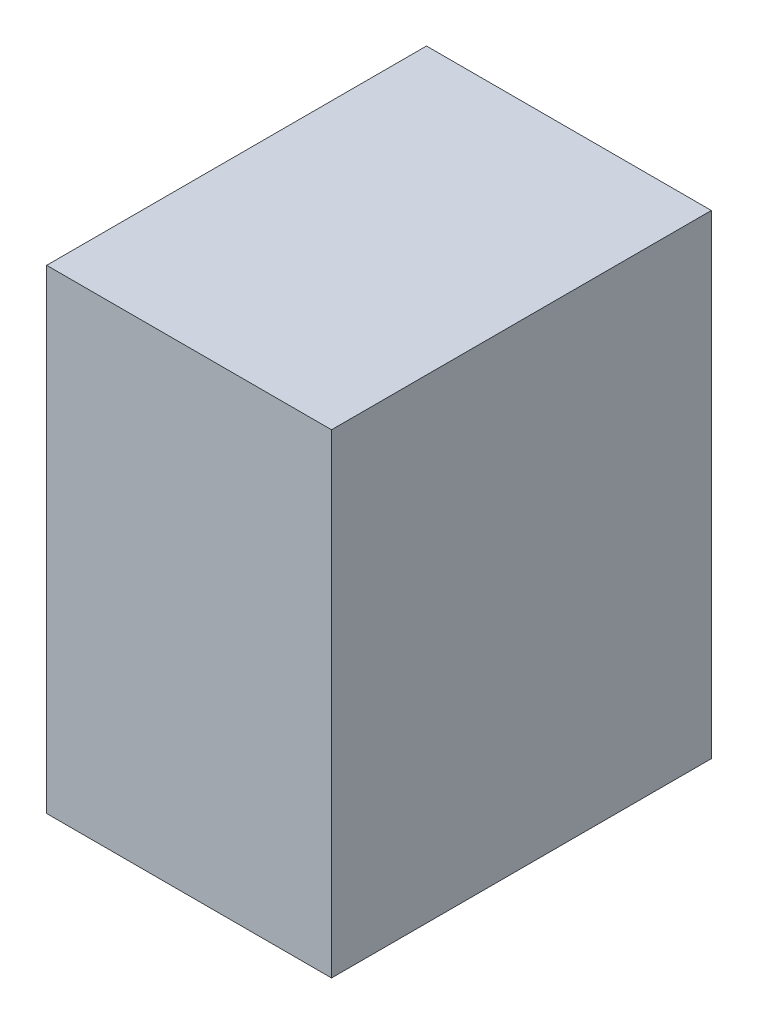
ISO-10303-21;
HEADER;
FILE_DESCRIPTION(('STEP AP214'),'2;1');
FILE_NAME('part.step','',(''),(''),'','','');
FILE_SCHEMA(('AUTOMOTIVE_DESIGN { 1 0 10303 214 1 1 1 1 }'));
ENDSEC;
DATA;
#1=APPLICATION_CONTEXT('core data for automotive mechanical design processes');
#2=APPLICATION_PROTOCOL_DEFINITION('international standard','automotive_design',2000,#1);
#3=PRODUCT_CONTEXT('',#1,'mechanical');
#4=PRODUCT('Part','Part','',(#3));
#5=PRODUCT_RELATED_PRODUCT_CATEGORY('part','',(#4));
#6=PRODUCT_DEFINITION_FORMATION('','',#4);
#7=PRODUCT_DEFINITION_CONTEXT('part definition',#1,'design');
#8=PRODUCT_DEFINITION('design','',#6,#7);
#9=PRODUCT_DEFINITION_SHAPE('','',#8);
#10=(LENGTH_UNIT() NAMED_UNIT(*) SI_UNIT(.MILLI.,.METRE.));
#11=(NAMED_UNIT(*) PLANE_ANGLE_UNIT() SI_UNIT($,.RADIAN.));
#12=(NAMED_UNIT(*) SI_UNIT($,.STERADIAN.) SOLID_ANGLE_UNIT());
#13=UNCERTAINTY_MEASURE_WITH_UNIT(LENGTH_MEASURE(1.E-05),#10,'distance_accuracy_value','');
#14=(GEOMETRIC_REPRESENTATION_CONTEXT(3) GLOBAL_UNCERTAINTY_ASSIGNED_CONTEXT((#13)) GLOBAL_UNIT_ASSIGNED_CONTEXT((#10,
#11,#12)) REPRESENTATION_CONTEXT('',''));
#15=CARTESIAN_POINT('',(0.,0.,0.));
#16=DIRECTION('',(0.,0.,1.));
#17=DIRECTION('',(1.,0.,0.));
#18=AXIS2_PLACEMENT_3D('',#15,#16,#17);
#19=CARTESIAN_POINT('',(0.,0.,0.));
#20=DIRECTION('',(0.,-1.,0.));
#21=DIRECTION('',(0.,0.,-1.));
#22=AXIS2_PLACEMENT_3D('',#19,#20,#21);
#23=PLANE('',#22);
#24=DIRECTION('',(0.,0.,1.));
#25=VECTOR('',#24,1.);
#26=CARTESIAN_POINT('',(-60.6591503626975,0.,10.3260635258258));
#27=LINE('',#26,#25);
#28=CARTESIAN_POINT('',(-60.6591503626975,0.,6.32606352582575));
#29=VERTEX_POINT('',#28);
#30=CARTESIAN_POINT('',(-60.6591503626975,0.,10.3260635258258));
#31=VERTEX_POINT('',#30);
#32=EDGE_CURVE('E147',#29,#31,#27,.T.);
#33=ORIENTED_EDGE('',*,*,#32,.F.);
#34=DIRECTION('',(-1.,0.,0.));
#35=VECTOR('',#34,1.);
#36=CARTESIAN_POINT('',(-60.6591503626975,0.,6.32606352582575));
#37=LINE('',#36,#35);
#38=CARTESIAN_POINT('',(-57.6591503626975,0.,6.32606352582575));
#39=VERTEX_POINT('',#38);
#40=EDGE_CURVE('E83',#39,#29,#37,.T.);
#41=ORIENTED_EDGE('',*,*,#40,.F.);
#42=DIRECTION('',(0.,0.,-1.));
#43=VECTOR('',#42,1.);
#44=CARTESIAN_POINT('',(-57.6591503626975,0.,10.3260635258258));
#45=LINE('',#44,#43);
#46=CARTESIAN_POINT('',(-57.6591503626975,0.,10.3260635258258));
#47=VERTEX_POINT('',#46);
#48=EDGE_CURVE('E162',#47,#39,#45,.T.);
#49=ORIENTED_EDGE('',*,*,#48,.F.);
#50=DIRECTION('',(1.,0.,0.));
#51=VECTOR('',#50,1.);
#52=CARTESIAN_POINT('',(-60.6591503626975,0.,10.3260635258258));
#53=LINE('',#52,#51);
#54=EDGE_CURVE('E160',#31,#47,#53,.T.);
#55=ORIENTED_EDGE('',*,*,#54,.F.);
#56=EDGE_LOOP('',(#33,#41,#49,#55));
#57=FACE_BOUND('',#56,.T.);
#58=DIRECTION('',(1.,0.,0.));
#59=VECTOR('',#58,1.);
#60=CARTESIAN_POINT('',(0.,0.,6.57606352582575));
#61=LINE('',#60,#59);
#62=CARTESIAN_POINT('',(-60.1591503626975,0.,6.57606352582575));
#63=VERTEX_POINT('',#62);
#64=CARTESIAN_POINT('',(-58.1591503626975,0.,6.57606352582575));
#65=VERTEX_POINT('',#64);
#66=EDGE_CURVE('E138',#63,#65,#61,.T.);
#67=ORIENTED_EDGE('',*,*,#66,.F.);
#68=DIRECTION('',(0.,0.,1.));
#69=VECTOR('',#68,1.);
#70=CARTESIAN_POINT('',(-60.1591503626975,0.,0.));
#71=LINE('',#70,#69);
#72=CARTESIAN_POINT('',(-60.1591503626975,0.,10.0760635258258));
#73=VERTEX_POINT('',#72);
#74=EDGE_CURVE('E53',#63,#73,#71,.T.);
#75=ORIENTED_EDGE('',*,*,#74,.T.);
#76=DIRECTION('',(1.,0.,0.));
#77=VECTOR('',#76,1.);
#78=CARTESIAN_POINT('',(0.,0.,10.0760635258258));
#79=LINE('',#78,#77);
#80=CARTESIAN_POINT('',(-58.1591503626975,0.,10.0760635258258));
#81=VERTEX_POINT('',#80);
#82=EDGE_CURVE('E128',#73,#81,#79,.T.);
#83=ORIENTED_EDGE('',*,*,#82,.T.);
#84=DIRECTION('',(0.,0.,1.));
#85=VECTOR('',#84,1.);
#86=CARTESIAN_POINT('',(-58.1591503626975,0.,0.));
#87=LINE('',#86,#85);
#88=EDGE_CURVE('E140',#65,#81,#87,.T.);
#89=ORIENTED_EDGE('',*,*,#88,.F.);
#90=EDGE_LOOP('',(#67,#75,#83,#89));
#91=FACE_BOUND('',#90,.T.);
#92=ADVANCED_FACE('F38',(#57,#91),#23,.T.);
#93=CARTESIAN_POINT('',(-60.6591503626975,5.,10.3260635258258));
#94=DIRECTION('',(1.,0.,0.));
#95=DIRECTION('',(0.,0.,-1.));
#96=AXIS2_PLACEMENT_3D('',#93,#94,#95);
#97=PLANE('',#96);
#98=ORIENTED_EDGE('',*,*,#32,.T.);
#99=DIRECTION('',(0.,-1.,0.));
#100=VECTOR('',#99,1.);
#101=CARTESIAN_POINT('',(-60.6591503626975,5.,10.3260635258258));
#102=LINE('',#101,#100);
#103=CARTESIAN_POINT('',(-60.6591503626975,5.,10.3260635258258));
#104=VERTEX_POINT('',#103);
#105=EDGE_CURVE('E11',#104,#31,#102,.T.);
#106=ORIENTED_EDGE('',*,*,#105,.F.);
#107=DIRECTION('',(0.,0.,1.));
#108=VECTOR('',#107,1.);
#109=CARTESIAN_POINT('',(-60.6591503626975,5.,10.3260635258258));
#110=LINE('',#109,#108);
#111=CARTESIAN_POINT('',(-60.6591503626975,5.,6.32606352582575));
#112=VERTEX_POINT('',#111);
#113=EDGE_CURVE('E151',#112,#104,#110,.T.);
#114=ORIENTED_EDGE('',*,*,#113,.F.);
#115=DIRECTION('',(0.,-1.,0.));
#116=VECTOR('',#115,1.);
#117=CARTESIAN_POINT('',(-60.6591503626975,5.,6.32606352582575));
#118=LINE('',#117,#116);
#119=EDGE_CURVE('E157',#112,#29,#118,.T.);
#120=ORIENTED_EDGE('',*,*,#119,.T.);
#121=EDGE_LOOP('',(#98,#106,#114,#120));
#122=FACE_BOUND('',#121,.T.);
#123=ADVANCED_FACE('F40',(#122),#97,.F.);
#124=CARTESIAN_POINT('',(-60.6591503626975,5.,10.3260635258258));
#125=DIRECTION('',(0.,0.,-1.));
#126=DIRECTION('',(-1.,0.,0.));
#127=AXIS2_PLACEMENT_3D('',#124,#125,#126);
#128=PLANE('',#127);
#129=ORIENTED_EDGE('',*,*,#54,.T.);
#130=DIRECTION('',(0.,-1.,0.));
#131=VECTOR('',#130,1.);
#132=CARTESIAN_POINT('',(-57.6591503626975,5.,10.3260635258258));
#133=LINE('',#132,#131);
#134=CARTESIAN_POINT('',(-57.6591503626975,5.,10.3260635258258));
#135=VERTEX_POINT('',#134);
#136=EDGE_CURVE('E46',#135,#47,#133,.T.);
#137=ORIENTED_EDGE('',*,*,#136,.F.);
#138=DIRECTION('',(1.,0.,0.));
#139=VECTOR('',#138,1.);
#140=CARTESIAN_POINT('',(-60.6591503626975,5.,10.3260635258258));
#141=LINE('',#140,#139);
#142=EDGE_CURVE('E90',#104,#135,#141,.T.);
#143=ORIENTED_EDGE('',*,*,#142,.F.);
#144=ORIENTED_EDGE('',*,*,#105,.T.);
#145=EDGE_LOOP('',(#129,#137,#143,#144));
#146=FACE_BOUND('',#145,.T.);
#147=ADVANCED_FACE('F188',(#146),#128,.F.);
#148=CARTESIAN_POINT('',(-57.6591503626975,5.,10.3260635258258));
#149=DIRECTION('',(-1.,0.,0.));
#150=DIRECTION('',(0.,0.,1.));
#151=AXIS2_PLACEMENT_3D('',#148,#149,#150);
#152=PLANE('',#151);
#153=ORIENTED_EDGE('',*,*,#48,.T.);
#154=DIRECTION('',(0.,-1.,0.));
#155=VECTOR('',#154,1.);
#156=CARTESIAN_POINT('',(-57.6591503626975,5.,6.32606352582575));
#157=LINE('',#156,#155);
#158=CARTESIAN_POINT('',(-57.6591503626975,5.,6.32606352582575));
#159=VERTEX_POINT('',#158);
#160=EDGE_CURVE('E166',#159,#39,#157,.T.);
#161=ORIENTED_EDGE('',*,*,#160,.F.);
#162=DIRECTION('',(0.,0.,-1.));
#163=VECTOR('',#162,1.);
#164=CARTESIAN_POINT('',(-57.6591503626975,5.,10.3260635258258));
#165=LINE('',#164,#163);
#166=EDGE_CURVE('E154',#135,#159,#165,.T.);
#167=ORIENTED_EDGE('',*,*,#166,.F.);
#168=ORIENTED_EDGE('',*,*,#136,.T.);
#169=EDGE_LOOP('',(#153,#161,#167,#168));
#170=FACE_BOUND('',#169,.T.);
#171=ADVANCED_FACE('F171',(#170),#152,.F.);
#172=CARTESIAN_POINT('',(-60.6591503626975,5.,6.32606352582575));
#173=DIRECTION('',(0.,0.,1.));
#174=DIRECTION('',(1.,0.,0.));
#175=AXIS2_PLACEMENT_3D('',#172,#173,#174);
#176=PLANE('',#175);
#177=ORIENTED_EDGE('',*,*,#40,.T.);
#178=ORIENTED_EDGE('',*,*,#119,.F.);
#179=DIRECTION('',(-1.,0.,0.));
#180=VECTOR('',#179,1.);
#181=CARTESIAN_POINT('',(-60.6591503626975,5.,6.32606352582575));
#182=LINE('',#181,#180);
#183=EDGE_CURVE('E62',#159,#112,#182,.T.);
#184=ORIENTED_EDGE('',*,*,#183,.F.);
#185=ORIENTED_EDGE('',*,*,#160,.T.);
#186=EDGE_LOOP('',(#177,#178,#184,#185));
#187=FACE_BOUND('',#186,.T.);
#188=ADVANCED_FACE('F179',(#187),#176,.F.);
#189=CARTESIAN_POINT('',(0.,5.,0.));
#190=DIRECTION('',(0.,-1.,0.));
#191=DIRECTION('',(0.,0.,-1.));
#192=AXIS2_PLACEMENT_3D('',#189,#190,#191);
#193=PLANE('',#192);
#194=ORIENTED_EDGE('',*,*,#113,.T.);
#195=ORIENTED_EDGE('',*,*,#142,.T.);
#196=ORIENTED_EDGE('',*,*,#166,.T.);
#197=ORIENTED_EDGE('',*,*,#183,.T.);
#198=EDGE_LOOP('',(#194,#195,#196,#197));
#199=FACE_BOUND('',#198,.T.);
#200=ADVANCED_FACE('F181',(#199),#193,.F.);
#201=CARTESIAN_POINT('',(-60.1591503626975,4.,0.));
#202=DIRECTION('',(1.,0.,0.));
#203=DIRECTION('',(0.,0.,-1.));
#204=AXIS2_PLACEMENT_3D('',#201,#202,#203);
#205=PLANE('',#204);
#206=ORIENTED_EDGE('',*,*,#74,.F.);
#207=DIRECTION('',(0.,-1.,0.));
#208=VECTOR('',#207,1.);
#209=CARTESIAN_POINT('',(-60.1591503626975,4.,6.57606352582575));
#210=LINE('',#209,#208);
#211=CARTESIAN_POINT('',(-60.1591503626975,4.,6.57606352582575));
#212=VERTEX_POINT('',#211);
#213=EDGE_CURVE('E111',#212,#63,#210,.T.);
#214=ORIENTED_EDGE('',*,*,#213,.F.);
#215=DIRECTION('',(0.,0.,1.));
#216=VECTOR('',#215,1.);
#217=CARTESIAN_POINT('',(-60.1591503626975,4.,0.));
#218=LINE('',#217,#216);
#219=CARTESIAN_POINT('',(-60.1591503626975,4.,10.0760635258258));
#220=VERTEX_POINT('',#219);
#221=EDGE_CURVE('E114',#212,#220,#218,.T.);
#222=ORIENTED_EDGE('',*,*,#221,.T.);
#223=DIRECTION('',(0.,-1.,0.));
#224=VECTOR('',#223,1.);
#225=CARTESIAN_POINT('',(-60.1591503626975,4.,10.0760635258258));
#226=LINE('',#225,#224);
#227=EDGE_CURVE('E145',#220,#73,#226,.T.);
#228=ORIENTED_EDGE('',*,*,#227,.T.);
#229=EDGE_LOOP('',(#206,#214,#222,#228));
#230=FACE_BOUND('',#229,.T.);
#231=ADVANCED_FACE('F113',(#230),#205,.T.);
#232=CARTESIAN_POINT('',(0.,4.,10.0760635258258));
#233=DIRECTION('',(0.,0.,-1.));
#234=DIRECTION('',(-1.,0.,0.));
#235=AXIS2_PLACEMENT_3D('',#232,#233,#234);
#236=PLANE('',#235);
#237=ORIENTED_EDGE('',*,*,#82,.F.);
#238=ORIENTED_EDGE('',*,*,#227,.F.);
#239=DIRECTION('',(1.,0.,0.));
#240=VECTOR('',#239,1.);
#241=CARTESIAN_POINT('',(0.,4.,10.0760635258258));
#242=LINE('',#241,#240);
#243=CARTESIAN_POINT('',(-58.1591503626975,4.,10.0760635258258));
#244=VERTEX_POINT('',#243);
#245=EDGE_CURVE('E121',#220,#244,#242,.T.);
#246=ORIENTED_EDGE('',*,*,#245,.T.);
#247=DIRECTION('',(0.,-1.,0.));
#248=VECTOR('',#247,1.);
#249=CARTESIAN_POINT('',(-58.1591503626975,4.,10.0760635258258));
#250=LINE('',#249,#248);
#251=EDGE_CURVE('E148',#244,#81,#250,.T.);
#252=ORIENTED_EDGE('',*,*,#251,.T.);
#253=EDGE_LOOP('',(#237,#238,#246,#252));
#254=FACE_BOUND('',#253,.T.);
#255=ADVANCED_FACE('F198',(#254),#236,.T.);
#256=CARTESIAN_POINT('',(-58.1591503626975,4.,0.));
#257=DIRECTION('',(1.,0.,0.));
#258=DIRECTION('',(0.,0.,-1.));
#259=AXIS2_PLACEMENT_3D('',#256,#257,#258);
#260=PLANE('',#259);
#261=ORIENTED_EDGE('',*,*,#88,.T.);
#262=ORIENTED_EDGE('',*,*,#251,.F.);
#263=DIRECTION('',(0.,0.,1.));
#264=VECTOR('',#263,1.);
#265=CARTESIAN_POINT('',(-58.1591503626975,4.,0.));
#266=LINE('',#265,#264);
#267=CARTESIAN_POINT('',(-58.1591503626975,4.,6.57606352582575));
#268=VERTEX_POINT('',#267);
#269=EDGE_CURVE('E132',#268,#244,#266,.T.);
#270=ORIENTED_EDGE('',*,*,#269,.F.);
#271=DIRECTION('',(0.,-1.,0.));
#272=VECTOR('',#271,1.);
#273=CARTESIAN_POINT('',(-58.1591503626975,4.,6.57606352582575));
#274=LINE('',#273,#272);
#275=EDGE_CURVE('E120',#268,#65,#274,.T.);
#276=ORIENTED_EDGE('',*,*,#275,.T.);
#277=EDGE_LOOP('',(#261,#262,#270,#276));
#278=FACE_BOUND('',#277,.T.);
#279=ADVANCED_FACE('F201',(#278),#260,.F.);
#280=CARTESIAN_POINT('',(0.,4.,6.57606352582575));
#281=DIRECTION('',(0.,0.,-1.));
#282=DIRECTION('',(-1.,0.,0.));
#283=AXIS2_PLACEMENT_3D('',#280,#281,#282);
#284=PLANE('',#283);
#285=ORIENTED_EDGE('',*,*,#66,.T.);
#286=ORIENTED_EDGE('',*,*,#275,.F.);
#287=DIRECTION('',(1.,0.,0.));
#288=VECTOR('',#287,1.);
#289=CARTESIAN_POINT('',(0.,4.,6.57606352582575));
#290=LINE('',#289,#288);
#291=EDGE_CURVE('E127',#212,#268,#290,.T.);
#292=ORIENTED_EDGE('',*,*,#291,.F.);
#293=ORIENTED_EDGE('',*,*,#213,.T.);
#294=EDGE_LOOP('',(#285,#286,#292,#293));
#295=FACE_BOUND('',#294,.T.);
#296=ADVANCED_FACE('F130',(#295),#284,.F.);
#297=CARTESIAN_POINT('',(0.,4.,0.));
#298=DIRECTION('',(0.,-1.,0.));
#299=DIRECTION('',(0.,0.,-1.));
#300=AXIS2_PLACEMENT_3D('',#297,#298,#299);
#301=PLANE('',#300);
#302=ORIENTED_EDGE('',*,*,#221,.F.);
#303=ORIENTED_EDGE('',*,*,#291,.T.);
#304=ORIENTED_EDGE('',*,*,#269,.T.);
#305=ORIENTED_EDGE('',*,*,#245,.F.);
#306=EDGE_LOOP('',(#302,#303,#304,#305));
#307=FACE_BOUND('',#306,.T.);
#308=ADVANCED_FACE('F125',(#307),#301,.T.);
#309=CLOSED_SHELL('',(#92,#123,#147,#171,#188,#200,#231,#255,#279,#296,#308));
#310=MANIFOLD_SOLID_BREP('B2',#309);
#311=ADVANCED_BREP_SHAPE_REPRESENTATION('',(#18,#310),#14);
#312=SHAPE_DEFINITION_REPRESENTATION(#9,#311);
ENDSEC;
END-ISO-10303-21;
